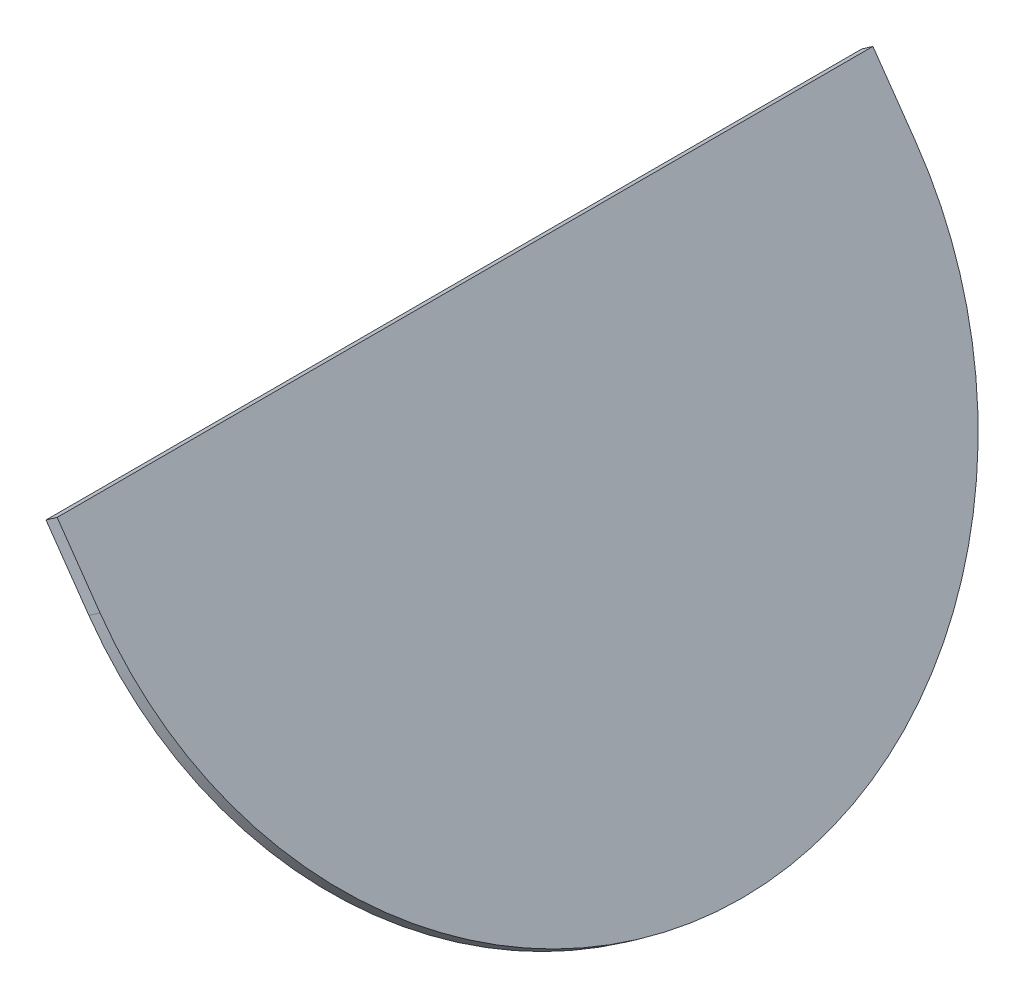
ISO-10303-21;
HEADER;
FILE_DESCRIPTION(('STEP AP214'),'2;1');
FILE_NAME('part.step','',(''),(''),'','','');
FILE_SCHEMA(('AUTOMOTIVE_DESIGN { 1 0 10303 214 1 1 1 1 }'));
ENDSEC;
DATA;
#1=APPLICATION_CONTEXT('core data for automotive mechanical design processes');
#2=APPLICATION_PROTOCOL_DEFINITION('international standard','automotive_design',2000,#1);
#3=PRODUCT_CONTEXT('',#1,'mechanical');
#4=PRODUCT('Part','Part','',(#3));
#5=PRODUCT_RELATED_PRODUCT_CATEGORY('part','',(#4));
#6=PRODUCT_DEFINITION_FORMATION('','',#4);
#7=PRODUCT_DEFINITION_CONTEXT('part definition',#1,'design');
#8=PRODUCT_DEFINITION('design','',#6,#7);
#9=PRODUCT_DEFINITION_SHAPE('','',#8);
#10=(LENGTH_UNIT() NAMED_UNIT(*) SI_UNIT(.MILLI.,.METRE.));
#11=(NAMED_UNIT(*) PLANE_ANGLE_UNIT() SI_UNIT($,.RADIAN.));
#12=(NAMED_UNIT(*) SI_UNIT($,.STERADIAN.) SOLID_ANGLE_UNIT());
#13=UNCERTAINTY_MEASURE_WITH_UNIT(LENGTH_MEASURE(1.E-05),#10,'distance_accuracy_value','');
#14=(GEOMETRIC_REPRESENTATION_CONTEXT(3) GLOBAL_UNCERTAINTY_ASSIGNED_CONTEXT((#13)) GLOBAL_UNIT_ASSIGNED_CONTEXT((#10,
#11,#12)) REPRESENTATION_CONTEXT('',''));
#15=CARTESIAN_POINT('',(0.,0.,0.));
#16=DIRECTION('',(0.,0.,1.));
#17=DIRECTION('',(1.,0.,0.));
#18=AXIS2_PLACEMENT_3D('',#15,#16,#17);
#19=CARTESIAN_POINT('',(723.67476080333,923.221845751932,1332.14744674369));
#20=DIRECTION('',(-0.573576436351044,0.819152044288993,0.));
#21=DIRECTION('',(-0.819152044288993,-0.573576436351044,0.));
#22=AXIS2_PLACEMENT_3D('',#19,#20,#21);
#23=PLANE('',#22);
#24=DIRECTION('',(0.,0.,1.));
#25=VECTOR('',#24,1.);
#26=CARTESIAN_POINT('',(725.313064891908,924.368998624634,1332.14744674369));
#27=LINE('',#26,#25);
#28=CARTESIAN_POINT('',(725.313064891908,924.368998624634,1212.14744674369));
#29=VERTEX_POINT('',#28);
#30=CARTESIAN_POINT('',(725.313064891908,924.368998624634,1332.14744674369));
#31=VERTEX_POINT('',#30);
#32=EDGE_CURVE('E103',#29,#31,#27,.T.);
#33=ORIENTED_EDGE('',*,*,#32,.F.);
#34=DIRECTION('',(0.819152044288993,0.573576436351044,0.));
#35=VECTOR('',#34,1.);
#36=CARTESIAN_POINT('',(723.67476080333,923.221845751932,1212.14744674369));
#37=LINE('',#36,#35);
#38=CARTESIAN_POINT('',(723.67476080333,923.221845751932,1212.14744674369));
#39=VERTEX_POINT('',#38);
#40=EDGE_CURVE('E11',#39,#29,#37,.T.);
#41=ORIENTED_EDGE('',*,*,#40,.F.);
#42=DIRECTION('',(0.,0.,1.));
#43=VECTOR('',#42,1.);
#44=CARTESIAN_POINT('',(723.67476080333,923.221845751932,1332.14744674369));
#45=LINE('',#44,#43);
#46=CARTESIAN_POINT('',(723.67476080333,923.221845751932,1332.14744674369));
#47=VERTEX_POINT('',#46);
#48=EDGE_CURVE('E97',#39,#47,#45,.T.);
#49=ORIENTED_EDGE('',*,*,#48,.T.);
#50=DIRECTION('',(0.819152044288993,0.573576436351044,0.));
#51=VECTOR('',#50,1.);
#52=CARTESIAN_POINT('',(723.67476080333,923.221845751932,1332.14744674369));
#53=LINE('',#52,#51);
#54=EDGE_CURVE('E42',#47,#31,#53,.T.);
#55=ORIENTED_EDGE('',*,*,#54,.T.);
#56=EDGE_LOOP('',(#33,#41,#49,#55));
#57=FACE_BOUND('',#56,.T.);
#58=ADVANCED_FACE('F39',(#57),#23,.T.);
#59=CARTESIAN_POINT('',(723.67476080333,923.221845751932,1212.14744674369));
#60=DIRECTION('',(0.,0.,-1.));
#61=DIRECTION('',(-1.,0.,0.));
#62=AXIS2_PLACEMENT_3D('',#59,#60,#61);
#63=PLANE('',#62);
#64=DIRECTION('',(-0.57357643635105,0.819152044288989,0.));
#65=VECTOR('',#64,1.);
#66=CARTESIAN_POINT('',(725.313064891908,924.368998624634,1212.14744674369));
#67=LINE('',#66,#65);
#68=CARTESIAN_POINT('',(731.62240569177,915.358326137455,1212.14744674369));
#69=VERTEX_POINT('',#68);
#70=EDGE_CURVE('E99',#69,#29,#67,.T.);
#71=ORIENTED_EDGE('',*,*,#70,.F.);
#72=DIRECTION('',(0.819152044288993,0.573576436351044,0.));
#73=VECTOR('',#72,1.);
#74=CARTESIAN_POINT('',(729.984101603192,914.211173264753,1212.14744674369));
#75=LINE('',#74,#73);
#76=CARTESIAN_POINT('',(729.984101603192,914.211173264753,1212.14744674369));
#77=VERTEX_POINT('',#76);
#78=EDGE_CURVE('E48',#77,#69,#75,.T.);
#79=ORIENTED_EDGE('',*,*,#78,.F.);
#80=DIRECTION('',(-0.57357643635105,0.819152044288989,0.));
#81=VECTOR('',#80,1.);
#82=CARTESIAN_POINT('',(723.67476080333,923.221845751932,1212.14744674369));
#83=LINE('',#82,#81);
#84=EDGE_CURVE('E94',#77,#39,#83,.T.);
#85=ORIENTED_EDGE('',*,*,#84,.T.);
#86=ORIENTED_EDGE('',*,*,#40,.T.);
#87=EDGE_LOOP('',(#71,#79,#85,#86));
#88=FACE_BOUND('',#87,.T.);
#89=ADVANCED_FACE('F113',(#88),#63,.T.);
#90=CARTESIAN_POINT('',(729.984101603192,914.211173264752,1272.14744674369));
#91=DIRECTION('',(0.819152044288993,0.573576436351044,0.));
#92=DIRECTION('',(-0.573576436351044,0.819152044288993,0.));
#93=AXIS2_PLACEMENT_3D('',#90,#91,#92);
#94=CYLINDRICAL_SURFACE('',#93,59.9999999999999);
#95=CARTESIAN_POINT('',(731.62240569177,915.358326137454,1272.14744674369));
#96=DIRECTION('',(0.819152044288993,0.573576436351044,0.));
#97=DIRECTION('',(-0.573576436351044,0.819152044288993,0.));
#98=AXIS2_PLACEMENT_3D('',#95,#96,#97);
#99=CIRCLE('',#98,59.9999999999999);
#100=CARTESIAN_POINT('',(731.62240569177,915.358326137455,1332.14744674369));
#101=VERTEX_POINT('',#100);
#102=EDGE_CURVE('E89',#101,#69,#99,.T.);
#103=ORIENTED_EDGE('',*,*,#102,.F.);
#104=DIRECTION('',(0.819152044288993,0.573576436351044,0.));
#105=VECTOR('',#104,1.);
#106=CARTESIAN_POINT('',(729.984101603192,914.211173264753,1332.14744674369));
#107=LINE('',#106,#105);
#108=CARTESIAN_POINT('',(729.984101603192,914.211173264753,1332.14744674369));
#109=VERTEX_POINT('',#108);
#110=EDGE_CURVE('E84',#109,#101,#107,.T.);
#111=ORIENTED_EDGE('',*,*,#110,.F.);
#112=CARTESIAN_POINT('',(729.984101603192,914.211173264752,1272.14744674369));
#113=DIRECTION('',(0.819152044288993,0.573576436351044,0.));
#114=DIRECTION('',(-0.573576436351044,0.819152044288993,0.));
#115=AXIS2_PLACEMENT_3D('',#112,#113,#114);
#116=CIRCLE('',#115,59.9999999999999);
#117=EDGE_CURVE('E87',#109,#77,#116,.T.);
#118=ORIENTED_EDGE('',*,*,#117,.T.);
#119=ORIENTED_EDGE('',*,*,#78,.T.);
#120=EDGE_LOOP('',(#103,#111,#118,#119));
#121=FACE_BOUND('',#120,.T.);
#122=ADVANCED_FACE('F86',(#121),#94,.T.);
#123=CARTESIAN_POINT('',(723.67476080333,923.221845751932,1332.14744674369));
#124=DIRECTION('',(0.,0.,1.));
#125=DIRECTION('',(1.,0.,0.));
#126=AXIS2_PLACEMENT_3D('',#123,#124,#125);
#127=PLANE('',#126);
#128=DIRECTION('',(0.57357643635105,-0.819152044288989,0.));
#129=VECTOR('',#128,1.);
#130=CARTESIAN_POINT('',(725.313064891908,924.368998624634,1332.14744674369));
#131=LINE('',#130,#129);
#132=EDGE_CURVE('E106',#31,#101,#131,.T.);
#133=ORIENTED_EDGE('',*,*,#132,.F.);
#134=ORIENTED_EDGE('',*,*,#54,.F.);
#135=DIRECTION('',(0.57357643635105,-0.819152044288989,0.));
#136=VECTOR('',#135,1.);
#137=CARTESIAN_POINT('',(723.67476080333,923.221845751932,1332.14744674369));
#138=LINE('',#137,#136);
#139=EDGE_CURVE('E93',#47,#109,#138,.T.);
#140=ORIENTED_EDGE('',*,*,#139,.T.);
#141=ORIENTED_EDGE('',*,*,#110,.T.);
#142=EDGE_LOOP('',(#133,#134,#140,#141));
#143=FACE_BOUND('',#142,.T.);
#144=ADVANCED_FACE('F96',(#143),#127,.T.);
#145=CARTESIAN_POINT('',(729.984101603192,914.211173264752,1272.14744674369));
#146=DIRECTION('',(0.819152044288993,0.573576436351044,0.));
#147=DIRECTION('',(-0.573576436351044,0.819152044288993,0.));
#148=AXIS2_PLACEMENT_3D('',#145,#146,#147);
#149=PLANE('',#148);
#150=ORIENTED_EDGE('',*,*,#48,.F.);
#151=ORIENTED_EDGE('',*,*,#84,.F.);
#152=ORIENTED_EDGE('',*,*,#117,.F.);
#153=ORIENTED_EDGE('',*,*,#139,.F.);
#154=EDGE_LOOP('',(#150,#151,#152,#153));
#155=FACE_BOUND('',#154,.T.);
#156=ADVANCED_FACE('F92',(#155),#149,.F.);
#157=CARTESIAN_POINT('',(731.62240569177,915.358326137454,1272.14744674369));
#158=DIRECTION('',(0.819152044288993,0.573576436351044,0.));
#159=DIRECTION('',(-0.573576436351044,0.819152044288993,0.));
#160=AXIS2_PLACEMENT_3D('',#157,#158,#159);
#161=PLANE('',#160);
#162=ORIENTED_EDGE('',*,*,#32,.T.);
#163=ORIENTED_EDGE('',*,*,#132,.T.);
#164=ORIENTED_EDGE('',*,*,#102,.T.);
#165=ORIENTED_EDGE('',*,*,#70,.T.);
#166=EDGE_LOOP('',(#162,#163,#164,#165));
#167=FACE_BOUND('',#166,.T.);
#168=ADVANCED_FACE('F112',(#167),#161,.T.);
#169=CLOSED_SHELL('',(#58,#89,#122,#144,#156,#168));
#170=MANIFOLD_SOLID_BREP('B2',#169);
#171=ADVANCED_BREP_SHAPE_REPRESENTATION('',(#18,#170),#14);
#172=SHAPE_DEFINITION_REPRESENTATION(#9,#171);
ENDSEC;
END-ISO-10303-21;
